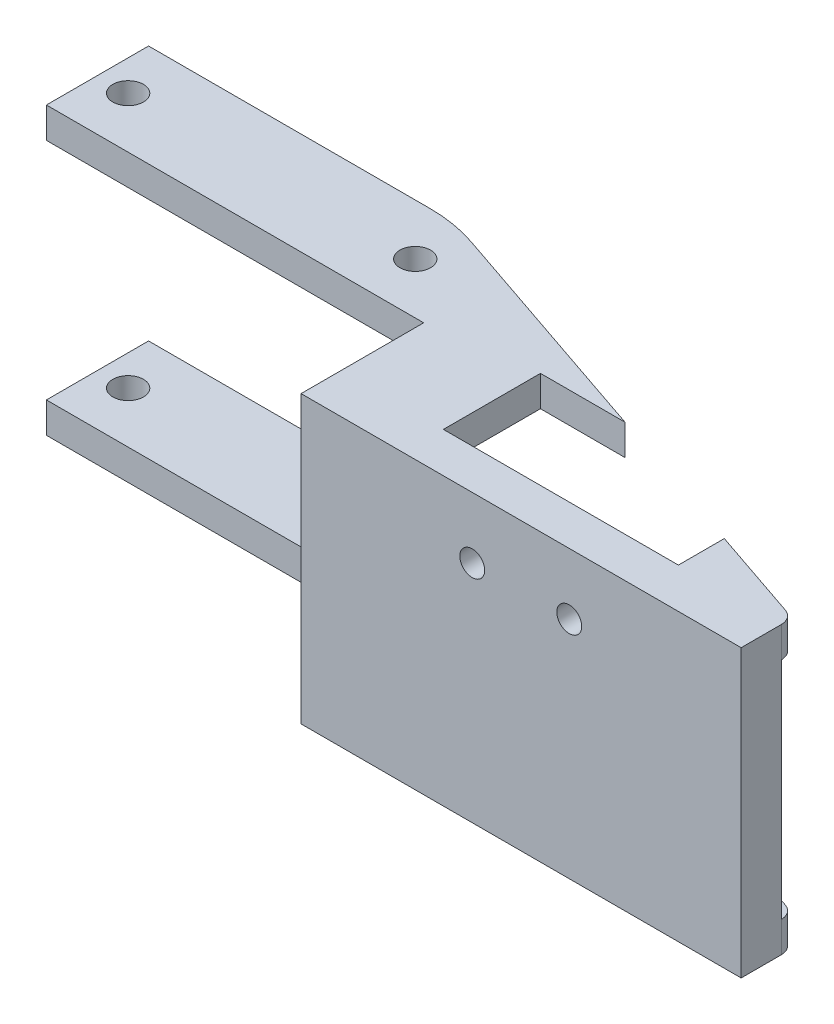
ISO-10303-21;
HEADER;
FILE_DESCRIPTION(('STEP AP214'),'2;1');
FILE_NAME('part.step','',(''),(''),'','','');
FILE_SCHEMA(('AUTOMOTIVE_DESIGN { 1 0 10303 214 1 1 1 1 }'));
ENDSEC;
DATA;
#1=APPLICATION_CONTEXT('core data for automotive mechanical design processes');
#2=APPLICATION_PROTOCOL_DEFINITION('international standard','automotive_design',2000,#1);
#3=PRODUCT_CONTEXT('',#1,'mechanical');
#4=PRODUCT('Part','Part','',(#3));
#5=PRODUCT_RELATED_PRODUCT_CATEGORY('part','',(#4));
#6=PRODUCT_DEFINITION_FORMATION('','',#4);
#7=PRODUCT_DEFINITION_CONTEXT('part definition',#1,'design');
#8=PRODUCT_DEFINITION('design','',#6,#7);
#9=PRODUCT_DEFINITION_SHAPE('','',#8);
#10=(LENGTH_UNIT() NAMED_UNIT(*) SI_UNIT(.MILLI.,.METRE.));
#11=(NAMED_UNIT(*) PLANE_ANGLE_UNIT() SI_UNIT($,.RADIAN.));
#12=(NAMED_UNIT(*) SI_UNIT($,.STERADIAN.) SOLID_ANGLE_UNIT());
#13=UNCERTAINTY_MEASURE_WITH_UNIT(LENGTH_MEASURE(1.E-05),#10,'distance_accuracy_value','');
#14=(GEOMETRIC_REPRESENTATION_CONTEXT(3) GLOBAL_UNCERTAINTY_ASSIGNED_CONTEXT((#13)) GLOBAL_UNIT_ASSIGNED_CONTEXT((#10,
#11,#12)) REPRESENTATION_CONTEXT('',''));
#15=CARTESIAN_POINT('',(0.,0.,0.));
#16=DIRECTION('',(0.,0.,1.));
#17=DIRECTION('',(1.,0.,0.));
#18=AXIS2_PLACEMENT_3D('',#15,#16,#17);
#19=CARTESIAN_POINT('',(-4.57792681080247,25.,-9.35629289120368));
#20=DIRECTION('',(-0.321902733238702,0.,0.946772744819713));
#21=DIRECTION('',(0.946772744819713,0.,0.321902733238702));
#22=AXIS2_PLACEMENT_3D('',#19,#20,#21);
#23=PLANE('',#22);
#24=DIRECTION('',(-0.946772744819713,0.,-0.321902733238702));
#25=VECTOR('',#24,1.);
#26=CARTESIAN_POINT('',(-4.57792681080247,25.,-9.35629289120368));
#27=LINE('',#26,#25);
#28=CARTESIAN_POINT('',(18.2796942841849,25.,-1.58470171890799));
#29=VERTEX_POINT('',#28);
#30=CARTESIAN_POINT('',(-4.57792681080247,25.,-9.35629289120368));
#31=VERTEX_POINT('',#30);
#32=EDGE_CURVE('E302',#29,#31,#27,.T.);
#33=ORIENTED_EDGE('',*,*,#32,.F.);
#34=DIRECTION('',(0.,-1.,0.));
#35=VECTOR('',#34,1.);
#36=CARTESIAN_POINT('',(18.2796942841849,25.,-1.58470171890799));
#37=LINE('',#36,#35);
#38=CARTESIAN_POINT('',(18.2796942841849,22.,-1.58470171890799));
#39=VERTEX_POINT('',#38);
#40=EDGE_CURVE('E325',#29,#39,#37,.T.);
#41=ORIENTED_EDGE('',*,*,#40,.T.);
#42=DIRECTION('',(-0.946772744819713,0.,-0.321902733238702));
#43=VECTOR('',#42,1.);
#44=CARTESIAN_POINT('',(-4.57792681080247,22.,-9.35629289120368));
#45=LINE('',#44,#43);
#46=CARTESIAN_POINT('',(-4.57792681080247,22.,-9.35629289120368));
#47=VERTEX_POINT('',#46);
#48=EDGE_CURVE('E277',#39,#47,#45,.T.);
#49=ORIENTED_EDGE('',*,*,#48,.T.);
#50=DIRECTION('',(0.,-1.,0.));
#51=VECTOR('',#50,1.);
#52=CARTESIAN_POINT('',(-4.57792681080247,25.,-9.35629289120368));
#53=LINE('',#52,#51);
#54=EDGE_CURVE('E242',#31,#47,#53,.T.);
#55=ORIENTED_EDGE('',*,*,#54,.F.);
#56=EDGE_LOOP('',(#33,#41,#49,#55));
#57=FACE_BOUND('',#56,.T.);
#58=ADVANCED_FACE('F32',(#57),#23,.F.);
#59=CARTESIAN_POINT('',(-9.406467809383,0.,4.84529828109201));
#60=DIRECTION('',(0.,-1.,0.));
#61=DIRECTION('',(0.,0.,-1.));
#62=AXIS2_PLACEMENT_3D('',#59,#60,#61);
#63=PLANE('',#62);
#64=CARTESIAN_POINT('',(-5.82618806875632,0.,-5.15470171890799));
#65=DIRECTION('',(0.,-1.,0.));
#66=DIRECTION('',(0.,0.,-1.));
#67=AXIS2_PLACEMENT_3D('',#64,#65,#66);
#68=CIRCLE('',#67,1.5);
#69=CARTESIAN_POINT('',(-5.82618806875632,0.,-6.65470171890798));
#70=VERTEX_POINT('',#69);
#71=EDGE_CURVE('E150',#70,#70,#68,.T.);
#72=ORIENTED_EDGE('',*,*,#71,.T.);
#73=EDGE_LOOP('',(#72));
#74=FACE_BOUND('',#73,.T.);
#75=CARTESIAN_POINT('',(-33.9261880687563,0.,-5.15470171890799));
#76=DIRECTION('',(0.,-1.,0.));
#77=DIRECTION('',(0.,0.,-1.));
#78=AXIS2_PLACEMENT_3D('',#75,#76,#77);
#79=CIRCLE('',#78,1.49999999999999);
#80=CARTESIAN_POINT('',(-33.9261880687563,0.,-6.65470171890798));
#81=VERTEX_POINT('',#80);
#82=EDGE_CURVE('E178',#81,#81,#79,.T.);
#83=ORIENTED_EDGE('',*,*,#82,.T.);
#84=EDGE_LOOP('',(#83));
#85=FACE_BOUND('',#84,.T.);
#86=DIRECTION('',(-1.,0.,0.));
#87=VECTOR('',#86,1.);
#88=CARTESIAN_POINT('',(0.,0.,7.91962779227332));
#89=LINE('',#88,#87);
#90=CARTESIAN_POINT('',(43.0738119312437,0.,7.91962779227332));
#91=VERTEX_POINT('',#90);
#92=CARTESIAN_POINT('',(0.,0.,7.91962779227332));
#93=VERTEX_POINT('',#92);
#94=EDGE_CURVE('E229',#91,#93,#89,.T.);
#95=ORIENTED_EDGE('',*,*,#94,.F.);
#96=CARTESIAN_POINT('',(41.5738119312437,0.,7.91962779227332));
#97=DIRECTION('',(0.,1.,0.));
#98=DIRECTION('',(0.,0.,-1.));
#99=AXIS2_PLACEMENT_3D('',#96,#97,#98);
#100=CIRCLE('',#99,1.5);
#101=CARTESIAN_POINT('',(42.0566660311017,0.,6.49946867504375));
#102=VERTEX_POINT('',#101);
#103=EDGE_CURVE('E146',#91,#102,#100,.T.);
#104=ORIENTED_EDGE('',*,*,#103,.T.);
#105=DIRECTION('',(-0.946772744819713,0.,-0.321902733238702));
#106=VECTOR('',#105,1.);
#107=CARTESIAN_POINT('',(-4.57792681080247,0.,-9.35629289120368));
#108=LINE('',#107,#106);
#109=CARTESIAN_POINT('',(-4.57792681080247,0.,-9.35629289120368));
#110=VERTEX_POINT('',#109);
#111=EDGE_CURVE('E149',#102,#110,#108,.T.);
#112=ORIENTED_EDGE('',*,*,#111,.T.);
#113=CARTESIAN_POINT('',(-9.406467809383,0.,4.84529828109201));
#114=DIRECTION('',(0.,1.,0.));
#115=DIRECTION('',(0.,0.,-1.));
#116=AXIS2_PLACEMENT_3D('',#113,#114,#115);
#117=CIRCLE('',#116,15.);
#118=CARTESIAN_POINT('',(-9.406467809383,0.,-10.154701718908));
#119=VERTEX_POINT('',#118);
#120=EDGE_CURVE('E153',#110,#119,#117,.T.);
#121=ORIENTED_EDGE('',*,*,#120,.T.);
#122=DIRECTION('',(-1.,0.,0.));
#123=VECTOR('',#122,1.);
#124=CARTESIAN_POINT('',(-36.9261880687563,0.,-10.154701718908));
#125=LINE('',#124,#123);
#126=CARTESIAN_POINT('',(-36.9261880687563,0.,-10.154701718908));
#127=VERTEX_POINT('',#126);
#128=EDGE_CURVE('E156',#119,#127,#125,.T.);
#129=ORIENTED_EDGE('',*,*,#128,.T.);
#130=DIRECTION('',(0.,0.,1.));
#131=VECTOR('',#130,1.);
#132=CARTESIAN_POINT('',(-36.9261880687563,0.,-10.154701718908));
#133=LINE('',#132,#131);
#134=CARTESIAN_POINT('',(-36.9261880687563,0.,-0.154701718907987));
#135=VERTEX_POINT('',#134);
#136=EDGE_CURVE('E159',#127,#135,#133,.T.);
#137=ORIENTED_EDGE('',*,*,#136,.T.);
#138=DIRECTION('',(1.,0.,0.));
#139=VECTOR('',#138,1.);
#140=CARTESIAN_POINT('',(-36.9261880687563,0.,-0.154701718907987));
#141=LINE('',#140,#139);
#142=CARTESIAN_POINT('',(0.,0.,-0.154701718907987));
#143=VERTEX_POINT('',#142);
#144=EDGE_CURVE('E162',#135,#143,#141,.T.);
#145=ORIENTED_EDGE('',*,*,#144,.T.);
#146=DIRECTION('',(0.,0.,1.));
#147=VECTOR('',#146,1.);
#148=CARTESIAN_POINT('',(0.,0.,11.845298281092));
#149=LINE('',#148,#147);
#150=EDGE_CURVE('E124',#143,#93,#149,.T.);
#151=ORIENTED_EDGE('',*,*,#150,.T.);
#152=EDGE_LOOP('',(#95,#104,#112,#121,#129,#137,#145,#151));
#153=FACE_BOUND('',#152,.T.);
#154=ADVANCED_FACE('F439',(#74,#85,#153),#63,.F.);
#155=CARTESIAN_POINT('',(43.0738119312437,-3.,7.91962779227332));
#156=DIRECTION('',(1.,0.,0.));
#157=DIRECTION('',(0.,0.,-1.));
#158=AXIS2_PLACEMENT_3D('',#155,#156,#157);
#159=PLANE('',#158);
#160=DIRECTION('',(0.,1.,0.));
#161=VECTOR('',#160,1.);
#162=CARTESIAN_POINT('',(43.0738119312437,-3.,7.91962779227332));
#163=LINE('',#162,#161);
#164=CARTESIAN_POINT('',(43.0738119312437,-3.,7.91962779227332));
#165=VERTEX_POINT('',#164);
#166=EDGE_CURVE('E97',#165,#91,#163,.T.);
#167=ORIENTED_EDGE('',*,*,#166,.T.);
#168=DIRECTION('',(0.,-1.,0.));
#169=VECTOR('',#168,1.);
#170=CARTESIAN_POINT('',(43.0738119312437,65.2523313021961,7.91962779227332));
#171=LINE('',#170,#169);
#172=CARTESIAN_POINT('',(43.0738119312437,22.,7.91962779227332));
#173=VERTEX_POINT('',#172);
#174=EDGE_CURVE('E192',#173,#91,#171,.T.);
#175=ORIENTED_EDGE('',*,*,#174,.F.);
#176=DIRECTION('',(0.,-1.,0.));
#177=VECTOR('',#176,1.);
#178=CARTESIAN_POINT('',(43.0738119312437,25.,7.91962779227332));
#179=LINE('',#178,#177);
#180=CARTESIAN_POINT('',(43.0738119312437,25.,7.91962779227332));
#181=VERTEX_POINT('',#180);
#182=EDGE_CURVE('E236',#181,#173,#179,.T.);
#183=ORIENTED_EDGE('',*,*,#182,.F.);
#184=DIRECTION('',(0.,0.,-1.));
#185=VECTOR('',#184,1.);
#186=CARTESIAN_POINT('',(43.0738119312437,25.,7.91962779227332));
#187=LINE('',#186,#185);
#188=CARTESIAN_POINT('',(43.0738119312437,25.,11.845298281092));
#189=VERTEX_POINT('',#188);
#190=EDGE_CURVE('E261',#189,#181,#187,.T.);
#191=ORIENTED_EDGE('',*,*,#190,.F.);
#192=DIRECTION('',(0.,1.,0.));
#193=VECTOR('',#192,1.);
#194=CARTESIAN_POINT('',(43.0738119312437,-3.,11.845298281092));
#195=LINE('',#194,#193);
#196=CARTESIAN_POINT('',(43.0738119312437,-3.,11.845298281092));
#197=VERTEX_POINT('',#196);
#198=EDGE_CURVE('E41',#197,#189,#195,.T.);
#199=ORIENTED_EDGE('',*,*,#198,.F.);
#200=DIRECTION('',(0.,0.,-1.));
#201=VECTOR('',#200,1.);
#202=CARTESIAN_POINT('',(43.0738119312437,-3.,7.91962779227332));
#203=LINE('',#202,#201);
#204=EDGE_CURVE('E165',#197,#165,#203,.T.);
#205=ORIENTED_EDGE('',*,*,#204,.T.);
#206=EDGE_LOOP('',(#167,#175,#183,#191,#199,#205));
#207=FACE_BOUND('',#206,.T.);
#208=ADVANCED_FACE('F34',(#207),#159,.T.);
#209=CARTESIAN_POINT('',(0.,-3.,11.845298281092));
#210=DIRECTION('',(0.,0.,1.));
#211=DIRECTION('',(1.,0.,0.));
#212=AXIS2_PLACEMENT_3D('',#209,#210,#211);
#213=PLANE('',#212);
#214=CARTESIAN_POINT('',(16.75,19.,11.845298281092));
#215=DIRECTION('',(0.,0.,1.));
#216=DIRECTION('',(1.,0.,0.));
#217=AXIS2_PLACEMENT_3D('',#214,#215,#216);
#218=CIRCLE('',#217,1.2192);
#219=CARTESIAN_POINT('',(17.9692,19.,11.845298281092));
#220=VERTEX_POINT('',#219);
#221=EDGE_CURVE('E357',#220,#220,#218,.T.);
#222=ORIENTED_EDGE('',*,*,#221,.F.);
#223=EDGE_LOOP('',(#222));
#224=FACE_BOUND('',#223,.T.);
#225=CARTESIAN_POINT('',(26.25,19.,11.845298281092));
#226=DIRECTION('',(0.,0.,1.));
#227=DIRECTION('',(1.,0.,0.));
#228=AXIS2_PLACEMENT_3D('',#225,#226,#227);
#229=CIRCLE('',#228,1.2192);
#230=CARTESIAN_POINT('',(27.4692,19.,11.845298281092));
#231=VERTEX_POINT('',#230);
#232=EDGE_CURVE('E351',#231,#231,#229,.T.);
#233=ORIENTED_EDGE('',*,*,#232,.F.);
#234=EDGE_LOOP('',(#233));
#235=FACE_BOUND('',#234,.T.);
#236=ORIENTED_EDGE('',*,*,#198,.T.);
#237=DIRECTION('',(1.,0.,0.));
#238=VECTOR('',#237,1.);
#239=CARTESIAN_POINT('',(0.,25.,11.845298281092));
#240=LINE('',#239,#238);
#241=CARTESIAN_POINT('',(0.,25.,11.845298281092));
#242=VERTEX_POINT('',#241);
#243=EDGE_CURVE('E257',#242,#189,#240,.T.);
#244=ORIENTED_EDGE('',*,*,#243,.F.);
#245=DIRECTION('',(0.,1.,0.));
#246=VECTOR('',#245,1.);
#247=CARTESIAN_POINT('',(0.,-3.,11.845298281092));
#248=LINE('',#247,#246);
#249=CARTESIAN_POINT('',(0.,-3.,11.845298281092));
#250=VERTEX_POINT('',#249);
#251=EDGE_CURVE('E126',#250,#242,#248,.T.);
#252=ORIENTED_EDGE('',*,*,#251,.F.);
#253=DIRECTION('',(1.,0.,0.));
#254=VECTOR('',#253,1.);
#255=CARTESIAN_POINT('',(0.,-3.,11.845298281092));
#256=LINE('',#255,#254);
#257=EDGE_CURVE('E136',#250,#197,#256,.T.);
#258=ORIENTED_EDGE('',*,*,#257,.T.);
#259=EDGE_LOOP('',(#236,#244,#252,#258));
#260=FACE_BOUND('',#259,.T.);
#261=ADVANCED_FACE('F364',(#224,#235,#260),#213,.T.);
#262=CARTESIAN_POINT('',(0.,-3.,11.845298281092));
#263=DIRECTION('',(-1.,0.,0.));
#264=DIRECTION('',(0.,0.,1.));
#265=AXIS2_PLACEMENT_3D('',#262,#263,#264);
#266=PLANE('',#265);
#267=ORIENTED_EDGE('',*,*,#150,.F.);
#268=DIRECTION('',(0.,1.,0.));
#269=VECTOR('',#268,1.);
#270=CARTESIAN_POINT('',(0.,-3.,-0.154701718907987));
#271=LINE('',#270,#269);
#272=CARTESIAN_POINT('',(0.,-3.,-0.154701718907987));
#273=VERTEX_POINT('',#272);
#274=EDGE_CURVE('E88',#273,#143,#271,.T.);
#275=ORIENTED_EDGE('',*,*,#274,.F.);
#276=DIRECTION('',(0.,0.,1.));
#277=VECTOR('',#276,1.);
#278=CARTESIAN_POINT('',(0.,-3.,11.845298281092));
#279=LINE('',#278,#277);
#280=EDGE_CURVE('E120',#273,#250,#279,.T.);
#281=ORIENTED_EDGE('',*,*,#280,.T.);
#282=ORIENTED_EDGE('',*,*,#251,.T.);
#283=DIRECTION('',(0.,0.,1.));
#284=VECTOR('',#283,1.);
#285=CARTESIAN_POINT('',(0.,25.,11.845298281092));
#286=LINE('',#285,#284);
#287=CARTESIAN_POINT('',(0.,25.,-0.154701718907987));
#288=VERTEX_POINT('',#287);
#289=EDGE_CURVE('E284',#288,#242,#286,.T.);
#290=ORIENTED_EDGE('',*,*,#289,.F.);
#291=DIRECTION('',(0.,-1.,0.));
#292=VECTOR('',#291,1.);
#293=CARTESIAN_POINT('',(0.,25.,-0.154701718907987));
#294=LINE('',#293,#292);
#295=CARTESIAN_POINT('',(0.,22.,-0.154701718907987));
#296=VERTEX_POINT('',#295);
#297=EDGE_CURVE('E254',#288,#296,#294,.T.);
#298=ORIENTED_EDGE('',*,*,#297,.T.);
#299=DIRECTION('',(0.,0.,1.));
#300=VECTOR('',#299,1.);
#301=CARTESIAN_POINT('',(0.,22.,11.845298281092));
#302=LINE('',#301,#300);
#303=CARTESIAN_POINT('',(0.,22.,7.91962779227332));
#304=VERTEX_POINT('',#303);
#305=EDGE_CURVE('E258',#296,#304,#302,.T.);
#306=ORIENTED_EDGE('',*,*,#305,.T.);
#307=DIRECTION('',(0.,-1.,0.));
#308=VECTOR('',#307,1.);
#309=CARTESIAN_POINT('',(0.,65.2523313021961,7.91962779227332));
#310=LINE('',#309,#308);
#311=EDGE_CURVE('E232',#304,#93,#310,.T.);
#312=ORIENTED_EDGE('',*,*,#311,.T.);
#313=EDGE_LOOP('',(#267,#275,#281,#282,#290,#298,#306,#312));
#314=FACE_BOUND('',#313,.T.);
#315=ADVANCED_FACE('F118',(#314),#266,.T.);
#316=CARTESIAN_POINT('',(-36.9261880687563,-3.,-0.154701718907987));
#317=DIRECTION('',(0.,0.,1.));
#318=DIRECTION('',(1.,0.,0.));
#319=AXIS2_PLACEMENT_3D('',#316,#317,#318);
#320=PLANE('',#319);
#321=ORIENTED_EDGE('',*,*,#144,.F.);
#322=DIRECTION('',(0.,1.,0.));
#323=VECTOR('',#322,1.);
#324=CARTESIAN_POINT('',(-36.9261880687563,-3.,-0.154701718907987));
#325=LINE('',#324,#323);
#326=CARTESIAN_POINT('',(-36.9261880687563,-3.,-0.154701718907987));
#327=VERTEX_POINT('',#326);
#328=EDGE_CURVE('E127',#327,#135,#325,.T.);
#329=ORIENTED_EDGE('',*,*,#328,.F.);
#330=DIRECTION('',(1.,0.,0.));
#331=VECTOR('',#330,1.);
#332=CARTESIAN_POINT('',(-36.9261880687563,-3.,-0.154701718907987));
#333=LINE('',#332,#331);
#334=EDGE_CURVE('E133',#327,#273,#333,.T.);
#335=ORIENTED_EDGE('',*,*,#334,.T.);
#336=ORIENTED_EDGE('',*,*,#274,.T.);
#337=EDGE_LOOP('',(#321,#329,#335,#336));
#338=FACE_BOUND('',#337,.T.);
#339=ADVANCED_FACE('F138',(#338),#320,.T.);
#340=CARTESIAN_POINT('',(-36.9261880687563,-3.,-10.154701718908));
#341=DIRECTION('',(-1.,0.,0.));
#342=DIRECTION('',(0.,0.,1.));
#343=AXIS2_PLACEMENT_3D('',#340,#341,#342);
#344=PLANE('',#343);
#345=ORIENTED_EDGE('',*,*,#136,.F.);
#346=DIRECTION('',(0.,1.,0.));
#347=VECTOR('',#346,1.);
#348=CARTESIAN_POINT('',(-36.9261880687563,-3.,-10.154701718908));
#349=LINE('',#348,#347);
#350=CARTESIAN_POINT('',(-36.9261880687563,-3.,-10.154701718908));
#351=VERTEX_POINT('',#350);
#352=EDGE_CURVE('E169',#351,#127,#349,.T.);
#353=ORIENTED_EDGE('',*,*,#352,.F.);
#354=DIRECTION('',(0.,0.,1.));
#355=VECTOR('',#354,1.);
#356=CARTESIAN_POINT('',(-36.9261880687563,-3.,-10.154701718908));
#357=LINE('',#356,#355);
#358=EDGE_CURVE('E139',#351,#327,#357,.T.);
#359=ORIENTED_EDGE('',*,*,#358,.T.);
#360=ORIENTED_EDGE('',*,*,#328,.T.);
#361=EDGE_LOOP('',(#345,#353,#359,#360));
#362=FACE_BOUND('',#361,.T.);
#363=ADVANCED_FACE('F530',(#362),#344,.T.);
#364=CARTESIAN_POINT('',(-36.9261880687563,-3.,-10.154701718908));
#365=DIRECTION('',(0.,0.,-1.));
#366=DIRECTION('',(-1.,0.,0.));
#367=AXIS2_PLACEMENT_3D('',#364,#365,#366);
#368=PLANE('',#367);
#369=ORIENTED_EDGE('',*,*,#128,.F.);
#370=DIRECTION('',(0.,1.,0.));
#371=VECTOR('',#370,1.);
#372=CARTESIAN_POINT('',(-9.406467809383,-3.,-10.154701718908));
#373=LINE('',#372,#371);
#374=CARTESIAN_POINT('',(-9.406467809383,-3.,-10.154701718908));
#375=VERTEX_POINT('',#374);
#376=EDGE_CURVE('E171',#375,#119,#373,.T.);
#377=ORIENTED_EDGE('',*,*,#376,.F.);
#378=DIRECTION('',(-1.,0.,0.));
#379=VECTOR('',#378,1.);
#380=CARTESIAN_POINT('',(-36.9261880687563,-3.,-10.154701718908));
#381=LINE('',#380,#379);
#382=EDGE_CURVE('E141',#375,#351,#381,.T.);
#383=ORIENTED_EDGE('',*,*,#382,.T.);
#384=ORIENTED_EDGE('',*,*,#352,.T.);
#385=EDGE_LOOP('',(#369,#377,#383,#384));
#386=FACE_BOUND('',#385,.T.);
#387=ADVANCED_FACE('F210',(#386),#368,.T.);
#388=CARTESIAN_POINT('',(-9.406467809383,-3.,4.84529828109201));
#389=DIRECTION('',(0.,1.,0.));
#390=DIRECTION('',(0.,0.,1.));
#391=AXIS2_PLACEMENT_3D('',#388,#389,#390);
#392=CYLINDRICAL_SURFACE('',#391,15.);
#393=ORIENTED_EDGE('',*,*,#120,.F.);
#394=DIRECTION('',(0.,1.,0.));
#395=VECTOR('',#394,1.);
#396=CARTESIAN_POINT('',(-4.57792681080247,-3.,-9.35629289120368));
#397=LINE('',#396,#395);
#398=CARTESIAN_POINT('',(-4.57792681080247,-3.,-9.35629289120368));
#399=VERTEX_POINT('',#398);
#400=EDGE_CURVE('E173',#399,#110,#397,.T.);
#401=ORIENTED_EDGE('',*,*,#400,.F.);
#402=CARTESIAN_POINT('',(-9.406467809383,-3.,4.84529828109201));
#403=DIRECTION('',(0.,1.,0.));
#404=DIRECTION('',(0.,0.,-1.));
#405=AXIS2_PLACEMENT_3D('',#402,#403,#404);
#406=CIRCLE('',#405,15.);
#407=EDGE_CURVE('E204',#399,#375,#406,.T.);
#408=ORIENTED_EDGE('',*,*,#407,.T.);
#409=ORIENTED_EDGE('',*,*,#376,.T.);
#410=EDGE_LOOP('',(#393,#401,#408,#409));
#411=FACE_BOUND('',#410,.T.);
#412=ADVANCED_FACE('F216',(#411),#392,.T.);
#413=CARTESIAN_POINT('',(-4.57792681080247,-3.,-9.35629289120368));
#414=DIRECTION('',(0.321902733238702,0.,-0.946772744819713));
#415=DIRECTION('',(-0.946772744819713,0.,-0.321902733238702));
#416=AXIS2_PLACEMENT_3D('',#413,#414,#415);
#417=PLANE('',#416);
#418=ORIENTED_EDGE('',*,*,#111,.F.);
#419=DIRECTION('',(0.,1.,0.));
#420=VECTOR('',#419,1.);
#421=CARTESIAN_POINT('',(42.0566660311017,-3.,6.49946867504375));
#422=LINE('',#421,#420);
#423=CARTESIAN_POINT('',(42.0566660311017,-3.,6.49946867504375));
#424=VERTEX_POINT('',#423);
#425=EDGE_CURVE('E175',#424,#102,#422,.T.);
#426=ORIENTED_EDGE('',*,*,#425,.F.);
#427=DIRECTION('',(-0.946772744819713,0.,-0.321902733238702));
#428=VECTOR('',#427,1.);
#429=CARTESIAN_POINT('',(-4.57792681080247,-3.,-9.35629289120368));
#430=LINE('',#429,#428);
#431=EDGE_CURVE('E201',#424,#399,#430,.T.);
#432=ORIENTED_EDGE('',*,*,#431,.T.);
#433=ORIENTED_EDGE('',*,*,#400,.T.);
#434=EDGE_LOOP('',(#418,#426,#432,#433));
#435=FACE_BOUND('',#434,.T.);
#436=ADVANCED_FACE('F219',(#435),#417,.T.);
#437=CARTESIAN_POINT('',(41.5738119312437,-3.,7.91962779227332));
#438=DIRECTION('',(0.,1.,0.));
#439=DIRECTION('',(0.,0.,1.));
#440=AXIS2_PLACEMENT_3D('',#437,#438,#439);
#441=CYLINDRICAL_SURFACE('',#440,1.5);
#442=ORIENTED_EDGE('',*,*,#103,.F.);
#443=ORIENTED_EDGE('',*,*,#166,.F.);
#444=CARTESIAN_POINT('',(41.5738119312437,-3.,7.91962779227332));
#445=DIRECTION('',(0.,1.,0.));
#446=DIRECTION('',(0.,0.,-1.));
#447=AXIS2_PLACEMENT_3D('',#444,#445,#446);
#448=CIRCLE('',#447,1.5);
#449=EDGE_CURVE('E199',#165,#424,#448,.T.);
#450=ORIENTED_EDGE('',*,*,#449,.T.);
#451=ORIENTED_EDGE('',*,*,#425,.T.);
#452=EDGE_LOOP('',(#442,#443,#450,#451));
#453=FACE_BOUND('',#452,.T.);
#454=ADVANCED_FACE('F220',(#453),#441,.T.);
#455=CARTESIAN_POINT('',(-9.406467809383,-3.,4.84529828109201));
#456=DIRECTION('',(0.,-1.,0.));
#457=DIRECTION('',(0.,0.,-1.));
#458=AXIS2_PLACEMENT_3D('',#455,#456,#457);
#459=PLANE('',#458);
#460=CARTESIAN_POINT('',(-33.9261880687563,-3.,-5.15470171890799));
#461=DIRECTION('',(0.,-1.,0.));
#462=DIRECTION('',(0.,0.,-1.));
#463=AXIS2_PLACEMENT_3D('',#460,#461,#462);
#464=CIRCLE('',#463,1.49999999999999);
#465=CARTESIAN_POINT('',(-33.9261880687563,-3.,-6.65470171890798));
#466=VERTEX_POINT('',#465);
#467=EDGE_CURVE('E181',#466,#466,#464,.T.);
#468=ORIENTED_EDGE('',*,*,#467,.F.);
#469=EDGE_LOOP('',(#468));
#470=FACE_BOUND('',#469,.T.);
#471=CARTESIAN_POINT('',(-5.82618806875632,-3.,-5.15470171890799));
#472=DIRECTION('',(0.,-1.,0.));
#473=DIRECTION('',(0.,0.,-1.));
#474=AXIS2_PLACEMENT_3D('',#471,#472,#473);
#475=CIRCLE('',#474,1.5);
#476=CARTESIAN_POINT('',(-5.82618806875632,-3.,-6.65470171890798));
#477=VERTEX_POINT('',#476);
#478=EDGE_CURVE('E180',#477,#477,#475,.T.);
#479=ORIENTED_EDGE('',*,*,#478,.F.);
#480=EDGE_LOOP('',(#479));
#481=FACE_BOUND('',#480,.T.);
#482=ORIENTED_EDGE('',*,*,#204,.F.);
#483=ORIENTED_EDGE('',*,*,#257,.F.);
#484=ORIENTED_EDGE('',*,*,#280,.F.);
#485=ORIENTED_EDGE('',*,*,#334,.F.);
#486=ORIENTED_EDGE('',*,*,#358,.F.);
#487=ORIENTED_EDGE('',*,*,#382,.F.);
#488=ORIENTED_EDGE('',*,*,#407,.F.);
#489=ORIENTED_EDGE('',*,*,#431,.F.);
#490=ORIENTED_EDGE('',*,*,#449,.F.);
#491=EDGE_LOOP('',(#482,#483,#484,#485,#486,#487,#488,#489,#490));
#492=FACE_BOUND('',#491,.T.);
#493=ADVANCED_FACE('F131',(#470,#481,#492),#459,.T.);
#494=CARTESIAN_POINT('',(-5.82618806875632,-3.,-5.15470171890799));
#495=DIRECTION('',(0.,-1.,0.));
#496=DIRECTION('',(0.,0.,-1.));
#497=AXIS2_PLACEMENT_3D('',#494,#495,#496);
#498=CYLINDRICAL_SURFACE('',#497,1.5);
#499=ORIENTED_EDGE('',*,*,#478,.T.);
#500=EDGE_LOOP('',(#499));
#501=FACE_BOUND('',#500,.T.);
#502=ORIENTED_EDGE('',*,*,#71,.F.);
#503=EDGE_LOOP('',(#502));
#504=FACE_BOUND('',#503,.T.);
#505=ADVANCED_FACE('F519',(#501,#504),#498,.F.);
#506=CARTESIAN_POINT('',(-33.9261880687563,-3.,-5.15470171890799));
#507=DIRECTION('',(0.,-1.,0.));
#508=DIRECTION('',(0.,0.,-1.));
#509=AXIS2_PLACEMENT_3D('',#506,#507,#508);
#510=CYLINDRICAL_SURFACE('',#509,1.49999999999999);
#511=ORIENTED_EDGE('',*,*,#467,.T.);
#512=EDGE_LOOP('',(#511));
#513=FACE_BOUND('',#512,.T.);
#514=ORIENTED_EDGE('',*,*,#82,.F.);
#515=EDGE_LOOP('',(#514));
#516=FACE_BOUND('',#515,.T.);
#517=ADVANCED_FACE('F515',(#513,#516),#510,.F.);
#518=CARTESIAN_POINT('',(0.,65.2523313021961,7.91962779227332));
#519=DIRECTION('',(0.,0.,1.));
#520=DIRECTION('',(1.,0.,0.));
#521=AXIS2_PLACEMENT_3D('',#518,#519,#520);
#522=PLANE('',#521);
#523=CARTESIAN_POINT('',(16.75,19.,7.91962779227332));
#524=DIRECTION('',(0.,0.,1.));
#525=DIRECTION('',(1.,0.,0.));
#526=AXIS2_PLACEMENT_3D('',#523,#524,#525);
#527=CIRCLE('',#526,1.2192);
#528=CARTESIAN_POINT('',(17.9692,19.,7.91962779227332));
#529=VERTEX_POINT('',#528);
#530=EDGE_CURVE('E354',#529,#529,#527,.T.);
#531=ORIENTED_EDGE('',*,*,#530,.T.);
#532=EDGE_LOOP('',(#531));
#533=FACE_BOUND('',#532,.T.);
#534=CARTESIAN_POINT('',(26.25,19.,7.91962779227332));
#535=DIRECTION('',(0.,0.,1.));
#536=DIRECTION('',(1.,0.,0.));
#537=AXIS2_PLACEMENT_3D('',#534,#535,#536);
#538=CIRCLE('',#537,1.2192);
#539=CARTESIAN_POINT('',(27.4692,19.,7.91962779227332));
#540=VERTEX_POINT('',#539);
#541=EDGE_CURVE('E36',#540,#540,#538,.T.);
#542=ORIENTED_EDGE('',*,*,#541,.T.);
#543=EDGE_LOOP('',(#542));
#544=FACE_BOUND('',#543,.T.);
#545=ORIENTED_EDGE('',*,*,#311,.F.);
#546=DIRECTION('',(1.,0.,0.));
#547=VECTOR('',#546,1.);
#548=CARTESIAN_POINT('',(0.,22.,7.91962779227332));
#549=LINE('',#548,#547);
#550=EDGE_CURVE('E187',#304,#173,#549,.T.);
#551=ORIENTED_EDGE('',*,*,#550,.T.);
#552=ORIENTED_EDGE('',*,*,#174,.T.);
#553=ORIENTED_EDGE('',*,*,#94,.T.);
#554=EDGE_LOOP('',(#545,#551,#552,#553));
#555=FACE_BOUND('',#554,.T.);
#556=ADVANCED_FACE('F227',(#533,#544,#555),#522,.F.);
#557=CARTESIAN_POINT('',(-9.406467809383,22.,4.84529828109201));
#558=DIRECTION('',(0.,-1.,0.));
#559=DIRECTION('',(0.,0.,-1.));
#560=AXIS2_PLACEMENT_3D('',#557,#558,#559);
#561=PLANE('',#560);
#562=DIRECTION('',(1.,0.,0.));
#563=VECTOR('',#562,1.);
#564=CARTESIAN_POINT('',(-9.406467809383,22.,-1.58470171890799));
#565=LINE('',#564,#563);
#566=CARTESIAN_POINT('',(10.,22.,-1.58470171890799));
#567=VERTEX_POINT('',#566);
#568=EDGE_CURVE('E322',#567,#39,#565,.T.);
#569=ORIENTED_EDGE('',*,*,#568,.F.);
#570=DIRECTION('',(0.,0.,-1.));
#571=VECTOR('',#570,1.);
#572=CARTESIAN_POINT('',(10.,22.,4.84529828109201));
#573=LINE('',#572,#571);
#574=CARTESIAN_POINT('',(10.,22.,7.91529828109201));
#575=VERTEX_POINT('',#574);
#576=EDGE_CURVE('E319',#575,#567,#573,.T.);
#577=ORIENTED_EDGE('',*,*,#576,.F.);
#578=DIRECTION('',(-1.,0.,0.));
#579=VECTOR('',#578,1.);
#580=CARTESIAN_POINT('',(-9.406467809383,22.,7.91529828109201));
#581=LINE('',#580,#579);
#582=CARTESIAN_POINT('',(33.,22.,7.91529828109201));
#583=VERTEX_POINT('',#582);
#584=EDGE_CURVE('E334',#583,#575,#581,.T.);
#585=ORIENTED_EDGE('',*,*,#584,.F.);
#586=DIRECTION('',(0.,0.,1.));
#587=VECTOR('',#586,1.);
#588=CARTESIAN_POINT('',(33.,22.,4.84529828109201));
#589=LINE('',#588,#587);
#590=CARTESIAN_POINT('',(33.,22.,3.42020222446916));
#591=VERTEX_POINT('',#590);
#592=EDGE_CURVE('E328',#591,#583,#589,.T.);
#593=ORIENTED_EDGE('',*,*,#592,.F.);
#594=CARTESIAN_POINT('',(42.0566660311017,22.,6.49946867504375));
#595=VERTEX_POINT('',#594);
#596=EDGE_CURVE('E274',#595,#591,#45,.T.);
#597=ORIENTED_EDGE('',*,*,#596,.F.);
#598=CARTESIAN_POINT('',(41.5738119312437,22.,7.91962779227332));
#599=DIRECTION('',(0.,1.,0.));
#600=DIRECTION('',(0.,0.,-1.));
#601=AXIS2_PLACEMENT_3D('',#598,#599,#600);
#602=CIRCLE('',#601,1.5);
#603=EDGE_CURVE('E278',#173,#595,#602,.T.);
#604=ORIENTED_EDGE('',*,*,#603,.F.);
#605=ORIENTED_EDGE('',*,*,#550,.F.);
#606=ORIENTED_EDGE('',*,*,#305,.F.);
#607=DIRECTION('',(1.,0.,0.));
#608=VECTOR('',#607,1.);
#609=CARTESIAN_POINT('',(-36.9261880687563,22.,-0.154701718907987));
#610=LINE('',#609,#608);
#611=CARTESIAN_POINT('',(-36.9261880687563,22.,-0.154701718907987));
#612=VERTEX_POINT('',#611);
#613=EDGE_CURVE('E262',#612,#296,#610,.T.);
#614=ORIENTED_EDGE('',*,*,#613,.F.);
#615=DIRECTION('',(0.,0.,1.));
#616=VECTOR('',#615,1.);
#617=CARTESIAN_POINT('',(-36.9261880687563,22.,-10.154701718908));
#618=LINE('',#617,#616);
#619=CARTESIAN_POINT('',(-36.9261880687563,22.,-10.154701718908));
#620=VERTEX_POINT('',#619);
#621=EDGE_CURVE('E265',#620,#612,#618,.T.);
#622=ORIENTED_EDGE('',*,*,#621,.F.);
#623=DIRECTION('',(-1.,0.,0.));
#624=VECTOR('',#623,1.);
#625=CARTESIAN_POINT('',(-36.9261880687563,22.,-10.154701718908));
#626=LINE('',#625,#624);
#627=CARTESIAN_POINT('',(-9.406467809383,22.,-10.154701718908));
#628=VERTEX_POINT('',#627);
#629=EDGE_CURVE('E268',#628,#620,#626,.T.);
#630=ORIENTED_EDGE('',*,*,#629,.F.);
#631=CARTESIAN_POINT('',(-9.406467809383,22.,4.84529828109201));
#632=DIRECTION('',(0.,1.,0.));
#633=DIRECTION('',(0.,0.,-1.));
#634=AXIS2_PLACEMENT_3D('',#631,#632,#633);
#635=CIRCLE('',#634,15.);
#636=EDGE_CURVE('E271',#47,#628,#635,.T.);
#637=ORIENTED_EDGE('',*,*,#636,.F.);
#638=ORIENTED_EDGE('',*,*,#48,.F.);
#639=EDGE_LOOP('',(#569,#577,#585,#593,#597,#604,#605,#606,#614,#622,#630,#637,#638));
#640=FACE_BOUND('',#639,.T.);
#641=CARTESIAN_POINT('',(-5.82618806875632,22.,-5.15470171890799));
#642=DIRECTION('',(0.,-1.,0.));
#643=DIRECTION('',(0.,0.,-1.));
#644=AXIS2_PLACEMENT_3D('',#641,#642,#643);
#645=CIRCLE('',#644,1.5);
#646=CARTESIAN_POINT('',(-5.82618806875632,22.,-6.65470171890798));
#647=VERTEX_POINT('',#646);
#648=EDGE_CURVE('E281',#647,#647,#645,.T.);
#649=ORIENTED_EDGE('',*,*,#648,.F.);
#650=EDGE_LOOP('',(#649));
#651=FACE_BOUND('',#650,.T.);
#652=CARTESIAN_POINT('',(-33.9261880687563,22.,-5.15470171890799));
#653=DIRECTION('',(0.,-1.,0.));
#654=DIRECTION('',(0.,0.,-1.));
#655=AXIS2_PLACEMENT_3D('',#652,#653,#654);
#656=CIRCLE('',#655,1.49999999999999);
#657=CARTESIAN_POINT('',(-33.9261880687563,22.,-6.65470171890798));
#658=VERTEX_POINT('',#657);
#659=EDGE_CURVE('E313',#658,#658,#656,.T.);
#660=ORIENTED_EDGE('',*,*,#659,.F.);
#661=EDGE_LOOP('',(#660));
#662=FACE_BOUND('',#661,.T.);
#663=ADVANCED_FACE('F391',(#640,#651,#662),#561,.T.);
#664=CARTESIAN_POINT('',(41.5738119312437,25.,7.91962779227332));
#665=DIRECTION('',(0.,-1.,0.));
#666=DIRECTION('',(0.,0.,-1.));
#667=AXIS2_PLACEMENT_3D('',#664,#665,#666);
#668=CYLINDRICAL_SURFACE('',#667,1.5);
#669=ORIENTED_EDGE('',*,*,#603,.T.);
#670=DIRECTION('',(0.,-1.,0.));
#671=VECTOR('',#670,1.);
#672=CARTESIAN_POINT('',(42.0566660311017,25.,6.49946867504375));
#673=LINE('',#672,#671);
#674=CARTESIAN_POINT('',(42.0566660311017,25.,6.49946867504375));
#675=VERTEX_POINT('',#674);
#676=EDGE_CURVE('E239',#675,#595,#673,.T.);
#677=ORIENTED_EDGE('',*,*,#676,.F.);
#678=CARTESIAN_POINT('',(41.5738119312437,25.,7.91962779227332));
#679=DIRECTION('',(0.,1.,0.));
#680=DIRECTION('',(0.,0.,-1.));
#681=AXIS2_PLACEMENT_3D('',#678,#679,#680);
#682=CIRCLE('',#681,1.5);
#683=EDGE_CURVE('E303',#181,#675,#682,.T.);
#684=ORIENTED_EDGE('',*,*,#683,.F.);
#685=ORIENTED_EDGE('',*,*,#182,.T.);
#686=EDGE_LOOP('',(#669,#677,#684,#685));
#687=FACE_BOUND('',#686,.T.);
#688=ADVANCED_FACE('F385',(#687),#668,.T.);
#689=ORIENTED_EDGE('',*,*,#596,.T.);
#690=DIRECTION('',(0.,1.,0.));
#691=VECTOR('',#690,1.);
#692=CARTESIAN_POINT('',(33.,25.,3.42020222446916));
#693=LINE('',#692,#691);
#694=CARTESIAN_POINT('',(33.,25.,3.42020222446916));
#695=VERTEX_POINT('',#694);
#696=EDGE_CURVE('E331',#591,#695,#693,.T.);
#697=ORIENTED_EDGE('',*,*,#696,.T.);
#698=EDGE_CURVE('E299',#675,#695,#27,.T.);
#699=ORIENTED_EDGE('',*,*,#698,.F.);
#700=ORIENTED_EDGE('',*,*,#676,.T.);
#701=EDGE_LOOP('',(#689,#697,#699,#700));
#702=FACE_BOUND('',#701,.T.);
#703=ADVANCED_FACE('F401',(#702),#23,.F.);
#704=CARTESIAN_POINT('',(-9.406467809383,25.,4.84529828109201));
#705=DIRECTION('',(0.,-1.,0.));
#706=DIRECTION('',(0.,0.,-1.));
#707=AXIS2_PLACEMENT_3D('',#704,#705,#706);
#708=CYLINDRICAL_SURFACE('',#707,15.);
#709=ORIENTED_EDGE('',*,*,#636,.T.);
#710=DIRECTION('',(0.,-1.,0.));
#711=VECTOR('',#710,1.);
#712=CARTESIAN_POINT('',(-9.406467809383,25.,-10.154701718908));
#713=LINE('',#712,#711);
#714=CARTESIAN_POINT('',(-9.406467809383,25.,-10.154701718908));
#715=VERTEX_POINT('',#714);
#716=EDGE_CURVE('E245',#715,#628,#713,.T.);
#717=ORIENTED_EDGE('',*,*,#716,.F.);
#718=CARTESIAN_POINT('',(-9.406467809383,25.,4.84529828109201));
#719=DIRECTION('',(0.,1.,0.));
#720=DIRECTION('',(0.,0.,-1.));
#721=AXIS2_PLACEMENT_3D('',#718,#719,#720);
#722=CIRCLE('',#721,15.);
#723=EDGE_CURVE('E296',#31,#715,#722,.T.);
#724=ORIENTED_EDGE('',*,*,#723,.F.);
#725=ORIENTED_EDGE('',*,*,#54,.T.);
#726=EDGE_LOOP('',(#709,#717,#724,#725));
#727=FACE_BOUND('',#726,.T.);
#728=ADVANCED_FACE('F459',(#727),#708,.T.);
#729=CARTESIAN_POINT('',(-36.9261880687563,25.,-10.154701718908));
#730=DIRECTION('',(0.,0.,1.));
#731=DIRECTION('',(1.,0.,0.));
#732=AXIS2_PLACEMENT_3D('',#729,#730,#731);
#733=PLANE('',#732);
#734=ORIENTED_EDGE('',*,*,#629,.T.);
#735=DIRECTION('',(0.,-1.,0.));
#736=VECTOR('',#735,1.);
#737=CARTESIAN_POINT('',(-36.9261880687563,25.,-10.154701718908));
#738=LINE('',#737,#736);
#739=CARTESIAN_POINT('',(-36.9261880687563,25.,-10.154701718908));
#740=VERTEX_POINT('',#739);
#741=EDGE_CURVE('E248',#740,#620,#738,.T.);
#742=ORIENTED_EDGE('',*,*,#741,.F.);
#743=DIRECTION('',(-1.,0.,0.));
#744=VECTOR('',#743,1.);
#745=CARTESIAN_POINT('',(-36.9261880687563,25.,-10.154701718908));
#746=LINE('',#745,#744);
#747=EDGE_CURVE('E293',#715,#740,#746,.T.);
#748=ORIENTED_EDGE('',*,*,#747,.F.);
#749=ORIENTED_EDGE('',*,*,#716,.T.);
#750=EDGE_LOOP('',(#734,#742,#748,#749));
#751=FACE_BOUND('',#750,.T.);
#752=ADVANCED_FACE('F454',(#751),#733,.F.);
#753=CARTESIAN_POINT('',(-36.9261880687563,25.,-10.154701718908));
#754=DIRECTION('',(1.,0.,0.));
#755=DIRECTION('',(0.,0.,-1.));
#756=AXIS2_PLACEMENT_3D('',#753,#754,#755);
#757=PLANE('',#756);
#758=ORIENTED_EDGE('',*,*,#621,.T.);
#759=DIRECTION('',(0.,-1.,0.));
#760=VECTOR('',#759,1.);
#761=CARTESIAN_POINT('',(-36.9261880687563,25.,-0.154701718907987));
#762=LINE('',#761,#760);
#763=CARTESIAN_POINT('',(-36.9261880687563,25.,-0.154701718907987));
#764=VERTEX_POINT('',#763);
#765=EDGE_CURVE('E251',#764,#612,#762,.T.);
#766=ORIENTED_EDGE('',*,*,#765,.F.);
#767=DIRECTION('',(0.,0.,1.));
#768=VECTOR('',#767,1.);
#769=CARTESIAN_POINT('',(-36.9261880687563,25.,-10.154701718908));
#770=LINE('',#769,#768);
#771=EDGE_CURVE('E290',#740,#764,#770,.T.);
#772=ORIENTED_EDGE('',*,*,#771,.F.);
#773=ORIENTED_EDGE('',*,*,#741,.T.);
#774=EDGE_LOOP('',(#758,#766,#772,#773));
#775=FACE_BOUND('',#774,.T.);
#776=ADVANCED_FACE('F450',(#775),#757,.F.);
#777=CARTESIAN_POINT('',(-36.9261880687563,25.,-0.154701718907987));
#778=DIRECTION('',(0.,0.,-1.));
#779=DIRECTION('',(-1.,0.,0.));
#780=AXIS2_PLACEMENT_3D('',#777,#778,#779);
#781=PLANE('',#780);
#782=ORIENTED_EDGE('',*,*,#613,.T.);
#783=ORIENTED_EDGE('',*,*,#297,.F.);
#784=DIRECTION('',(1.,0.,0.));
#785=VECTOR('',#784,1.);
#786=CARTESIAN_POINT('',(-36.9261880687563,25.,-0.154701718907987));
#787=LINE('',#786,#785);
#788=EDGE_CURVE('E287',#764,#288,#787,.T.);
#789=ORIENTED_EDGE('',*,*,#788,.F.);
#790=ORIENTED_EDGE('',*,*,#765,.T.);
#791=EDGE_LOOP('',(#782,#783,#789,#790));
#792=FACE_BOUND('',#791,.T.);
#793=ADVANCED_FACE('F445',(#792),#781,.F.);
#794=CARTESIAN_POINT('',(-9.406467809383,25.,4.84529828109201));
#795=DIRECTION('',(0.,-1.,0.));
#796=DIRECTION('',(0.,0.,-1.));
#797=AXIS2_PLACEMENT_3D('',#794,#795,#796);
#798=PLANE('',#797);
#799=CARTESIAN_POINT('',(-33.9261880687563,25.,-5.15470171890799));
#800=DIRECTION('',(0.,-1.,0.));
#801=DIRECTION('',(0.,0.,-1.));
#802=AXIS2_PLACEMENT_3D('',#799,#800,#801);
#803=CIRCLE('',#802,1.49999999999999);
#804=CARTESIAN_POINT('',(-33.9261880687563,25.,-6.65470171890798));
#805=VERTEX_POINT('',#804);
#806=EDGE_CURVE('E316',#805,#805,#803,.T.);
#807=ORIENTED_EDGE('',*,*,#806,.T.);
#808=EDGE_LOOP('',(#807));
#809=FACE_BOUND('',#808,.T.);
#810=CARTESIAN_POINT('',(-5.82618806875632,25.,-5.15470171890799));
#811=DIRECTION('',(0.,-1.,0.));
#812=DIRECTION('',(0.,0.,-1.));
#813=AXIS2_PLACEMENT_3D('',#810,#811,#812);
#814=CIRCLE('',#813,1.49999999999999);
#815=CARTESIAN_POINT('',(-5.82618806875632,25.,-6.65470171890798));
#816=VERTEX_POINT('',#815);
#817=EDGE_CURVE('E310',#816,#816,#814,.T.);
#818=ORIENTED_EDGE('',*,*,#817,.T.);
#819=EDGE_LOOP('',(#818));
#820=FACE_BOUND('',#819,.T.);
#821=DIRECTION('',(0.,0.,1.));
#822=VECTOR('',#821,1.);
#823=CARTESIAN_POINT('',(10.,25.,-1.58470171890799));
#824=LINE('',#823,#822);
#825=CARTESIAN_POINT('',(10.,25.,-1.58470171890799));
#826=VERTEX_POINT('',#825);
#827=CARTESIAN_POINT('',(10.,25.,7.91529828109201));
#828=VERTEX_POINT('',#827);
#829=EDGE_CURVE('E48',#826,#828,#824,.T.);
#830=ORIENTED_EDGE('',*,*,#829,.F.);
#831=DIRECTION('',(1.,0.,0.));
#832=VECTOR('',#831,1.);
#833=CARTESIAN_POINT('',(-9.406467809383,25.,-1.58470171890799));
#834=LINE('',#833,#832);
#835=EDGE_CURVE('E11',#826,#29,#834,.T.);
#836=ORIENTED_EDGE('',*,*,#835,.T.);
#837=ORIENTED_EDGE('',*,*,#32,.T.);
#838=ORIENTED_EDGE('',*,*,#723,.T.);
#839=ORIENTED_EDGE('',*,*,#747,.T.);
#840=ORIENTED_EDGE('',*,*,#771,.T.);
#841=ORIENTED_EDGE('',*,*,#788,.T.);
#842=ORIENTED_EDGE('',*,*,#289,.T.);
#843=ORIENTED_EDGE('',*,*,#243,.T.);
#844=ORIENTED_EDGE('',*,*,#190,.T.);
#845=ORIENTED_EDGE('',*,*,#683,.T.);
#846=ORIENTED_EDGE('',*,*,#698,.T.);
#847=DIRECTION('',(0.,0.,-1.));
#848=VECTOR('',#847,1.);
#849=CARTESIAN_POINT('',(33.,25.,-1.58470171890799));
#850=LINE('',#849,#848);
#851=CARTESIAN_POINT('',(33.,25.,7.91529828109201));
#852=VERTEX_POINT('',#851);
#853=EDGE_CURVE('E341',#852,#695,#850,.T.);
#854=ORIENTED_EDGE('',*,*,#853,.F.);
#855=DIRECTION('',(1.,0.,0.));
#856=VECTOR('',#855,1.);
#857=CARTESIAN_POINT('',(10.,25.,7.91529828109201));
#858=LINE('',#857,#856);
#859=EDGE_CURVE('E347',#828,#852,#858,.T.);
#860=ORIENTED_EDGE('',*,*,#859,.F.);
#861=EDGE_LOOP('',(#830,#836,#837,#838,#839,#840,#841,#842,#843,#844,#845,#846,#854,#860));
#862=FACE_BOUND('',#861,.T.);
#863=ADVANCED_FACE('F376',(#809,#820,#862),#798,.F.);
#864=CARTESIAN_POINT('',(-5.82618806875632,-3.,-5.15470171890799));
#865=DIRECTION('',(0.,-1.,0.));
#866=DIRECTION('',(0.,0.,-1.));
#867=AXIS2_PLACEMENT_3D('',#864,#865,#866);
#868=CYLINDRICAL_SURFACE('',#867,1.5);
#869=ORIENTED_EDGE('',*,*,#648,.T.);
#870=EDGE_LOOP('',(#869));
#871=FACE_BOUND('',#870,.T.);
#872=ORIENTED_EDGE('',*,*,#817,.F.);
#873=EDGE_LOOP('',(#872));
#874=FACE_BOUND('',#873,.T.);
#875=ADVANCED_FACE('F490',(#871,#874),#868,.F.);
#876=CARTESIAN_POINT('',(-33.9261880687563,-3.,-5.15470171890799));
#877=DIRECTION('',(0.,-1.,0.));
#878=DIRECTION('',(0.,0.,-1.));
#879=AXIS2_PLACEMENT_3D('',#876,#877,#878);
#880=CYLINDRICAL_SURFACE('',#879,1.49999999999999);
#881=ORIENTED_EDGE('',*,*,#659,.T.);
#882=EDGE_LOOP('',(#881));
#883=FACE_BOUND('',#882,.T.);
#884=ORIENTED_EDGE('',*,*,#806,.F.);
#885=EDGE_LOOP('',(#884));
#886=FACE_BOUND('',#885,.T.);
#887=ADVANCED_FACE('F483',(#883,#886),#880,.F.);
#888=CARTESIAN_POINT('',(10.,15.,-1.58470171890799));
#889=DIRECTION('',(-1.,0.,0.));
#890=DIRECTION('',(0.,0.,1.));
#891=AXIS2_PLACEMENT_3D('',#888,#889,#890);
#892=PLANE('',#891);
#893=ORIENTED_EDGE('',*,*,#576,.T.);
#894=DIRECTION('',(0.,1.,0.));
#895=VECTOR('',#894,1.);
#896=CARTESIAN_POINT('',(10.,15.,-1.58470171890799));
#897=LINE('',#896,#895);
#898=EDGE_CURVE('E337',#567,#826,#897,.T.);
#899=ORIENTED_EDGE('',*,*,#898,.T.);
#900=ORIENTED_EDGE('',*,*,#829,.T.);
#901=DIRECTION('',(0.,1.,0.));
#902=VECTOR('',#901,1.);
#903=CARTESIAN_POINT('',(10.,15.,7.91529828109201));
#904=LINE('',#903,#902);
#905=EDGE_CURVE('E338',#575,#828,#904,.T.);
#906=ORIENTED_EDGE('',*,*,#905,.F.);
#907=EDGE_LOOP('',(#893,#899,#900,#906));
#908=FACE_BOUND('',#907,.T.);
#909=ADVANCED_FACE('F481',(#908),#892,.F.);
#910=CARTESIAN_POINT('',(10.,15.,-1.58470171890799));
#911=DIRECTION('',(0.,0.,-1.));
#912=DIRECTION('',(-1.,0.,0.));
#913=AXIS2_PLACEMENT_3D('',#910,#911,#912);
#914=PLANE('',#913);
#915=ORIENTED_EDGE('',*,*,#568,.T.);
#916=ORIENTED_EDGE('',*,*,#40,.F.);
#917=ORIENTED_EDGE('',*,*,#835,.F.);
#918=ORIENTED_EDGE('',*,*,#898,.F.);
#919=EDGE_LOOP('',(#915,#916,#917,#918));
#920=FACE_BOUND('',#919,.T.);
#921=ADVANCED_FACE('F466',(#920),#914,.F.);
#922=CARTESIAN_POINT('',(33.,15.,-1.58470171890799));
#923=DIRECTION('',(1.,0.,0.));
#924=DIRECTION('',(0.,0.,-1.));
#925=AXIS2_PLACEMENT_3D('',#922,#923,#924);
#926=PLANE('',#925);
#927=ORIENTED_EDGE('',*,*,#592,.T.);
#928=DIRECTION('',(0.,1.,0.));
#929=VECTOR('',#928,1.);
#930=CARTESIAN_POINT('',(33.,15.,7.91529828109201));
#931=LINE('',#930,#929);
#932=EDGE_CURVE('E340',#583,#852,#931,.T.);
#933=ORIENTED_EDGE('',*,*,#932,.T.);
#934=ORIENTED_EDGE('',*,*,#853,.T.);
#935=ORIENTED_EDGE('',*,*,#696,.F.);
#936=EDGE_LOOP('',(#927,#933,#934,#935));
#937=FACE_BOUND('',#936,.T.);
#938=ADVANCED_FACE('F477',(#937),#926,.F.);
#939=CARTESIAN_POINT('',(10.,15.,7.91529828109201));
#940=DIRECTION('',(0.,0.,1.));
#941=DIRECTION('',(1.,0.,0.));
#942=AXIS2_PLACEMENT_3D('',#939,#940,#941);
#943=PLANE('',#942);
#944=ORIENTED_EDGE('',*,*,#584,.T.);
#945=ORIENTED_EDGE('',*,*,#905,.T.);
#946=ORIENTED_EDGE('',*,*,#859,.T.);
#947=ORIENTED_EDGE('',*,*,#932,.F.);
#948=EDGE_LOOP('',(#944,#945,#946,#947));
#949=FACE_BOUND('',#948,.T.);
#950=ADVANCED_FACE('F479',(#949),#943,.F.);
#951=CARTESIAN_POINT('',(26.25,19.,11.845298281092));
#952=DIRECTION('',(0.,0.,1.));
#953=DIRECTION('',(1.,0.,0.));
#954=AXIS2_PLACEMENT_3D('',#951,#952,#953);
#955=CYLINDRICAL_SURFACE('',#954,1.2192);
#956=ORIENTED_EDGE('',*,*,#232,.T.);
#957=EDGE_LOOP('',(#956));
#958=FACE_BOUND('',#957,.T.);
#959=ORIENTED_EDGE('',*,*,#541,.F.);
#960=EDGE_LOOP('',(#959));
#961=FACE_BOUND('',#960,.T.);
#962=ADVANCED_FACE('F619',(#958,#961),#955,.F.);
#963=CARTESIAN_POINT('',(16.75,19.,11.845298281092));
#964=DIRECTION('',(0.,0.,1.));
#965=DIRECTION('',(1.,0.,0.));
#966=AXIS2_PLACEMENT_3D('',#963,#964,#965);
#967=CYLINDRICAL_SURFACE('',#966,1.2192);
#968=ORIENTED_EDGE('',*,*,#221,.T.);
#969=EDGE_LOOP('',(#968));
#970=FACE_BOUND('',#969,.T.);
#971=ORIENTED_EDGE('',*,*,#530,.F.);
#972=EDGE_LOOP('',(#971));
#973=FACE_BOUND('',#972,.T.);
#974=ADVANCED_FACE('F361',(#970,#973),#967,.F.);
#975=CLOSED_SHELL('',(#58,#154,#208,#261,#315,#339,#363,#387,#412,#436,#454,#493,#505,#517,#556,
#663,#688,#703,#728,#752,#776,#793,#863,#875,#887,#909,#921,#938,#950,#962,#974));
#976=MANIFOLD_SOLID_BREP('B2',#975);
#977=ADVANCED_BREP_SHAPE_REPRESENTATION('',(#18,#976),#14);
#978=SHAPE_DEFINITION_REPRESENTATION(#9,#977);
ENDSEC;
END-ISO-10303-21;
